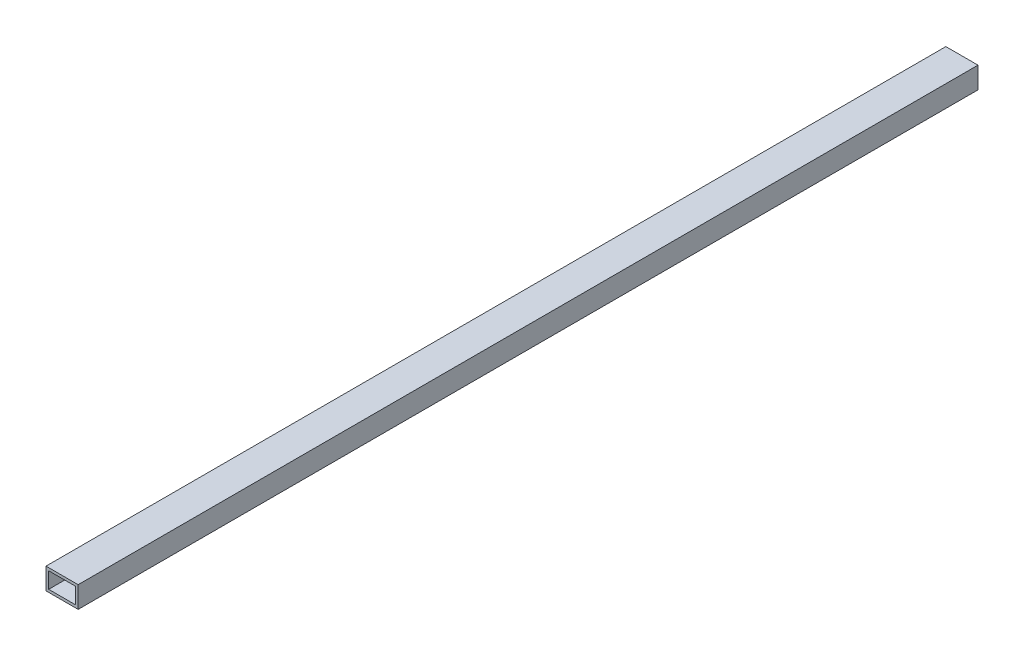
ISO-10303-21;
HEADER;
FILE_DESCRIPTION(('STEP AP214'),'2;1');
FILE_NAME('part.step','',(''),(''),'','','');
FILE_SCHEMA(('AUTOMOTIVE_DESIGN { 1 0 10303 214 1 1 1 1 }'));
ENDSEC;
DATA;
#1=APPLICATION_CONTEXT('core data for automotive mechanical design processes');
#2=APPLICATION_PROTOCOL_DEFINITION('international standard','automotive_design',2000,#1);
#3=PRODUCT_CONTEXT('',#1,'mechanical');
#4=PRODUCT('Part','Part','',(#3));
#5=PRODUCT_RELATED_PRODUCT_CATEGORY('part','',(#4));
#6=PRODUCT_DEFINITION_FORMATION('','',#4);
#7=PRODUCT_DEFINITION_CONTEXT('part definition',#1,'design');
#8=PRODUCT_DEFINITION('design','',#6,#7);
#9=PRODUCT_DEFINITION_SHAPE('','',#8);
#10=(LENGTH_UNIT() NAMED_UNIT(*) SI_UNIT(.MILLI.,.METRE.));
#11=(NAMED_UNIT(*) PLANE_ANGLE_UNIT() SI_UNIT($,.RADIAN.));
#12=(NAMED_UNIT(*) SI_UNIT($,.STERADIAN.) SOLID_ANGLE_UNIT());
#13=UNCERTAINTY_MEASURE_WITH_UNIT(LENGTH_MEASURE(1.E-05),#10,'distance_accuracy_value','');
#14=(GEOMETRIC_REPRESENTATION_CONTEXT(3) GLOBAL_UNCERTAINTY_ASSIGNED_CONTEXT((#13)) GLOBAL_UNIT_ASSIGNED_CONTEXT((#10,
#11,#12)) REPRESENTATION_CONTEXT('',''));
#15=CARTESIAN_POINT('',(0.,0.,0.));
#16=DIRECTION('',(0.,0.,1.));
#17=DIRECTION('',(1.,0.,0.));
#18=AXIS2_PLACEMENT_3D('',#15,#16,#17);
#19=CARTESIAN_POINT('',(19.05,12.7,1066.8));
#20=DIRECTION('',(-1.,0.,0.));
#21=DIRECTION('',(0.,-1.,0.));
#22=AXIS2_PLACEMENT_3D('',#19,#20,#21);
#23=PLANE('',#22);
#24=DIRECTION('',(0.,1.,0.));
#25=VECTOR('',#24,1.);
#26=CARTESIAN_POINT('',(19.05,12.7,0.));
#27=LINE('',#26,#25);
#28=CARTESIAN_POINT('',(19.05,-12.7,0.));
#29=VERTEX_POINT('',#28);
#30=CARTESIAN_POINT('',(19.05,12.7,0.));
#31=VERTEX_POINT('',#30);
#32=EDGE_CURVE('E145',#29,#31,#27,.T.);
#33=ORIENTED_EDGE('',*,*,#32,.T.);
#34=DIRECTION('',(0.,0.,-1.));
#35=VECTOR('',#34,1.);
#36=CARTESIAN_POINT('',(19.05,12.7,1066.8));
#37=LINE('',#36,#35);
#38=CARTESIAN_POINT('',(19.05,12.7,1066.8));
#39=VERTEX_POINT('',#38);
#40=EDGE_CURVE('E11',#39,#31,#37,.T.);
#41=ORIENTED_EDGE('',*,*,#40,.F.);
#42=DIRECTION('',(0.,1.,0.));
#43=VECTOR('',#42,1.);
#44=CARTESIAN_POINT('',(19.05,12.7,1066.8));
#45=LINE('',#44,#43);
#46=CARTESIAN_POINT('',(19.05,-12.7,1066.8));
#47=VERTEX_POINT('',#46);
#48=EDGE_CURVE('E134',#47,#39,#45,.T.);
#49=ORIENTED_EDGE('',*,*,#48,.F.);
#50=DIRECTION('',(0.,0.,-1.));
#51=VECTOR('',#50,1.);
#52=CARTESIAN_POINT('',(19.05,-12.7,1066.8));
#53=LINE('',#52,#51);
#54=EDGE_CURVE('E144',#47,#29,#53,.T.);
#55=ORIENTED_EDGE('',*,*,#54,.T.);
#56=EDGE_LOOP('',(#33,#41,#49,#55));
#57=FACE_BOUND('',#56,.T.);
#58=ADVANCED_FACE('F37',(#57),#23,.F.);
#59=CARTESIAN_POINT('',(-19.05,12.7,1066.8));
#60=DIRECTION('',(0.,-1.,0.));
#61=DIRECTION('',(0.,0.,-1.));
#62=AXIS2_PLACEMENT_3D('',#59,#60,#61);
#63=PLANE('',#62);
#64=DIRECTION('',(-1.,0.,0.));
#65=VECTOR('',#64,1.);
#66=CARTESIAN_POINT('',(-19.05,12.7,0.));
#67=LINE('',#66,#65);
#68=CARTESIAN_POINT('',(-19.05,12.7,0.));
#69=VERTEX_POINT('',#68);
#70=EDGE_CURVE('E148',#31,#69,#67,.T.);
#71=ORIENTED_EDGE('',*,*,#70,.T.);
#72=DIRECTION('',(0.,0.,-1.));
#73=VECTOR('',#72,1.);
#74=CARTESIAN_POINT('',(-19.05,12.7,1066.8));
#75=LINE('',#74,#73);
#76=CARTESIAN_POINT('',(-19.05,12.7,1066.8));
#77=VERTEX_POINT('',#76);
#78=EDGE_CURVE('E44',#77,#69,#75,.T.);
#79=ORIENTED_EDGE('',*,*,#78,.F.);
#80=DIRECTION('',(-1.,0.,0.));
#81=VECTOR('',#80,1.);
#82=CARTESIAN_POINT('',(-19.05,12.7,1066.8));
#83=LINE('',#82,#81);
#84=EDGE_CURVE('E137',#39,#77,#83,.T.);
#85=ORIENTED_EDGE('',*,*,#84,.F.);
#86=ORIENTED_EDGE('',*,*,#40,.T.);
#87=EDGE_LOOP('',(#71,#79,#85,#86));
#88=FACE_BOUND('',#87,.T.);
#89=ADVANCED_FACE('F176',(#88),#63,.F.);
#90=CARTESIAN_POINT('',(-19.05,12.7,1066.8));
#91=DIRECTION('',(1.,0.,0.));
#92=DIRECTION('',(0.,1.,0.));
#93=AXIS2_PLACEMENT_3D('',#90,#91,#92);
#94=PLANE('',#93);
#95=DIRECTION('',(0.,-1.,0.));
#96=VECTOR('',#95,1.);
#97=CARTESIAN_POINT('',(-19.05,12.7,0.));
#98=LINE('',#97,#96);
#99=CARTESIAN_POINT('',(-19.05,-12.7,0.));
#100=VERTEX_POINT('',#99);
#101=EDGE_CURVE('E150',#69,#100,#98,.T.);
#102=ORIENTED_EDGE('',*,*,#101,.T.);
#103=DIRECTION('',(0.,0.,-1.));
#104=VECTOR('',#103,1.);
#105=CARTESIAN_POINT('',(-19.05,-12.7,1066.8));
#106=LINE('',#105,#104);
#107=CARTESIAN_POINT('',(-19.05,-12.7,1066.8));
#108=VERTEX_POINT('',#107);
#109=EDGE_CURVE('E155',#108,#100,#106,.T.);
#110=ORIENTED_EDGE('',*,*,#109,.F.);
#111=DIRECTION('',(0.,-1.,0.));
#112=VECTOR('',#111,1.);
#113=CARTESIAN_POINT('',(-19.05,12.7,1066.8));
#114=LINE('',#113,#112);
#115=EDGE_CURVE('E140',#77,#108,#114,.T.);
#116=ORIENTED_EDGE('',*,*,#115,.F.);
#117=ORIENTED_EDGE('',*,*,#78,.T.);
#118=EDGE_LOOP('',(#102,#110,#116,#117));
#119=FACE_BOUND('',#118,.T.);
#120=ADVANCED_FACE('F162',(#119),#94,.F.);
#121=CARTESIAN_POINT('',(-19.05,-12.7,1066.8));
#122=DIRECTION('',(0.,1.,0.));
#123=DIRECTION('',(0.,0.,1.));
#124=AXIS2_PLACEMENT_3D('',#121,#122,#123);
#125=PLANE('',#124);
#126=DIRECTION('',(1.,0.,0.));
#127=VECTOR('',#126,1.);
#128=CARTESIAN_POINT('',(-19.05,-12.7,0.));
#129=LINE('',#128,#127);
#130=EDGE_CURVE('E138',#100,#29,#129,.T.);
#131=ORIENTED_EDGE('',*,*,#130,.T.);
#132=ORIENTED_EDGE('',*,*,#54,.F.);
#133=DIRECTION('',(1.,0.,0.));
#134=VECTOR('',#133,1.);
#135=CARTESIAN_POINT('',(-19.05,-12.7,1066.8));
#136=LINE('',#135,#134);
#137=EDGE_CURVE('E142',#108,#47,#136,.T.);
#138=ORIENTED_EDGE('',*,*,#137,.F.);
#139=ORIENTED_EDGE('',*,*,#109,.T.);
#140=EDGE_LOOP('',(#131,#132,#138,#139));
#141=FACE_BOUND('',#140,.T.);
#142=ADVANCED_FACE('F169',(#141),#125,.F.);
#143=CARTESIAN_POINT('',(0.,0.,1066.8));
#144=DIRECTION('',(0.,0.,1.));
#145=DIRECTION('',(1.,0.,0.));
#146=AXIS2_PLACEMENT_3D('',#143,#144,#145);
#147=PLANE('',#146);
#148=DIRECTION('',(0.,1.,0.));
#149=VECTOR('',#148,1.);
#150=CARTESIAN_POINT('',(15.875,12.7,1066.8));
#151=LINE('',#150,#149);
#152=CARTESIAN_POINT('',(15.875,-9.525,1066.8));
#153=VERTEX_POINT('',#152);
#154=CARTESIAN_POINT('',(15.875,9.525,1066.8));
#155=VERTEX_POINT('',#154);
#156=EDGE_CURVE('E122',#153,#155,#151,.T.);
#157=ORIENTED_EDGE('',*,*,#156,.F.);
#158=DIRECTION('',(1.,0.,0.));
#159=VECTOR('',#158,1.);
#160=CARTESIAN_POINT('',(-19.05,-9.525,1066.8));
#161=LINE('',#160,#159);
#162=CARTESIAN_POINT('',(-15.875,-9.525,1066.8));
#163=VERTEX_POINT('',#162);
#164=EDGE_CURVE('E106',#163,#153,#161,.T.);
#165=ORIENTED_EDGE('',*,*,#164,.F.);
#166=DIRECTION('',(0.,-1.,0.));
#167=VECTOR('',#166,1.);
#168=CARTESIAN_POINT('',(-15.875,12.7,1066.8));
#169=LINE('',#168,#167);
#170=CARTESIAN_POINT('',(-15.875,9.525,1066.8));
#171=VERTEX_POINT('',#170);
#172=EDGE_CURVE('E131',#171,#163,#169,.T.);
#173=ORIENTED_EDGE('',*,*,#172,.F.);
#174=DIRECTION('',(-1.,0.,0.));
#175=VECTOR('',#174,1.);
#176=CARTESIAN_POINT('',(-19.05,9.525,1066.8));
#177=LINE('',#176,#175);
#178=EDGE_CURVE('E124',#155,#171,#177,.T.);
#179=ORIENTED_EDGE('',*,*,#178,.F.);
#180=EDGE_LOOP('',(#157,#165,#173,#179));
#181=FACE_BOUND('',#180,.T.);
#182=ORIENTED_EDGE('',*,*,#48,.T.);
#183=ORIENTED_EDGE('',*,*,#84,.T.);
#184=ORIENTED_EDGE('',*,*,#115,.T.);
#185=ORIENTED_EDGE('',*,*,#137,.T.);
#186=EDGE_LOOP('',(#182,#183,#184,#185));
#187=FACE_BOUND('',#186,.T.);
#188=ADVANCED_FACE('F175',(#181,#187),#147,.T.);
#189=CARTESIAN_POINT('',(0.,0.,0.));
#190=DIRECTION('',(0.,0.,1.));
#191=DIRECTION('',(1.,0.,0.));
#192=AXIS2_PLACEMENT_3D('',#189,#190,#191);
#193=PLANE('',#192);
#194=DIRECTION('',(1.,0.,0.));
#195=VECTOR('',#194,1.);
#196=CARTESIAN_POINT('',(-19.05,-9.525,0.));
#197=LINE('',#196,#195);
#198=CARTESIAN_POINT('',(-15.875,-9.525,0.));
#199=VERTEX_POINT('',#198);
#200=CARTESIAN_POINT('',(15.875,-9.525,0.));
#201=VERTEX_POINT('',#200);
#202=EDGE_CURVE('E104',#199,#201,#197,.T.);
#203=ORIENTED_EDGE('',*,*,#202,.T.);
#204=DIRECTION('',(0.,1.,0.));
#205=VECTOR('',#204,1.);
#206=CARTESIAN_POINT('',(15.875,12.7,0.));
#207=LINE('',#206,#205);
#208=CARTESIAN_POINT('',(15.875,9.525,0.));
#209=VERTEX_POINT('',#208);
#210=EDGE_CURVE('E112',#201,#209,#207,.T.);
#211=ORIENTED_EDGE('',*,*,#210,.T.);
#212=DIRECTION('',(-1.,0.,0.));
#213=VECTOR('',#212,1.);
#214=CARTESIAN_POINT('',(-19.05,9.525,0.));
#215=LINE('',#214,#213);
#216=CARTESIAN_POINT('',(-15.875,9.525,0.));
#217=VERTEX_POINT('',#216);
#218=EDGE_CURVE('E118',#209,#217,#215,.T.);
#219=ORIENTED_EDGE('',*,*,#218,.T.);
#220=DIRECTION('',(0.,-1.,0.));
#221=VECTOR('',#220,1.);
#222=CARTESIAN_POINT('',(-15.875,12.7,0.));
#223=LINE('',#222,#221);
#224=EDGE_CURVE('E58',#217,#199,#223,.T.);
#225=ORIENTED_EDGE('',*,*,#224,.T.);
#226=EDGE_LOOP('',(#203,#211,#219,#225));
#227=FACE_BOUND('',#226,.T.);
#228=ORIENTED_EDGE('',*,*,#32,.F.);
#229=ORIENTED_EDGE('',*,*,#130,.F.);
#230=ORIENTED_EDGE('',*,*,#101,.F.);
#231=ORIENTED_EDGE('',*,*,#70,.F.);
#232=EDGE_LOOP('',(#228,#229,#230,#231));
#233=FACE_BOUND('',#232,.T.);
#234=ADVANCED_FACE('F120',(#227,#233),#193,.F.);
#235=CARTESIAN_POINT('',(15.875,12.7,1066.8));
#236=DIRECTION('',(-1.,0.,0.));
#237=DIRECTION('',(0.,-1.,0.));
#238=AXIS2_PLACEMENT_3D('',#235,#236,#237);
#239=PLANE('',#238);
#240=ORIENTED_EDGE('',*,*,#210,.F.);
#241=DIRECTION('',(0.,0.,-1.));
#242=VECTOR('',#241,1.);
#243=CARTESIAN_POINT('',(15.875,-9.525,1066.8));
#244=LINE('',#243,#242);
#245=EDGE_CURVE('E100',#153,#201,#244,.T.);
#246=ORIENTED_EDGE('',*,*,#245,.F.);
#247=ORIENTED_EDGE('',*,*,#156,.T.);
#248=DIRECTION('',(0.,0.,-1.));
#249=VECTOR('',#248,1.);
#250=CARTESIAN_POINT('',(15.875,9.525,1066.8));
#251=LINE('',#250,#249);
#252=EDGE_CURVE('E115',#155,#209,#251,.T.);
#253=ORIENTED_EDGE('',*,*,#252,.T.);
#254=EDGE_LOOP('',(#240,#246,#247,#253));
#255=FACE_BOUND('',#254,.T.);
#256=ADVANCED_FACE('F113',(#255),#239,.T.);
#257=CARTESIAN_POINT('',(-19.05,9.525,1066.8));
#258=DIRECTION('',(0.,-1.,0.));
#259=DIRECTION('',(0.,0.,-1.));
#260=AXIS2_PLACEMENT_3D('',#257,#258,#259);
#261=PLANE('',#260);
#262=ORIENTED_EDGE('',*,*,#218,.F.);
#263=ORIENTED_EDGE('',*,*,#252,.F.);
#264=ORIENTED_EDGE('',*,*,#178,.T.);
#265=DIRECTION('',(0.,0.,-1.));
#266=VECTOR('',#265,1.);
#267=CARTESIAN_POINT('',(-15.875,9.525,1066.8));
#268=LINE('',#267,#266);
#269=EDGE_CURVE('E280',#171,#217,#268,.T.);
#270=ORIENTED_EDGE('',*,*,#269,.T.);
#271=EDGE_LOOP('',(#262,#263,#264,#270));
#272=FACE_BOUND('',#271,.T.);
#273=ADVANCED_FACE('F196',(#272),#261,.T.);
#274=CARTESIAN_POINT('',(-15.875,12.7,1066.8));
#275=DIRECTION('',(1.,0.,0.));
#276=DIRECTION('',(0.,1.,0.));
#277=AXIS2_PLACEMENT_3D('',#274,#275,#276);
#278=PLANE('',#277);
#279=ORIENTED_EDGE('',*,*,#224,.F.);
#280=ORIENTED_EDGE('',*,*,#269,.F.);
#281=ORIENTED_EDGE('',*,*,#172,.T.);
#282=DIRECTION('',(0.,0.,-1.));
#283=VECTOR('',#282,1.);
#284=CARTESIAN_POINT('',(-15.875,-9.525,1066.8));
#285=LINE('',#284,#283);
#286=EDGE_CURVE('E51',#163,#199,#285,.T.);
#287=ORIENTED_EDGE('',*,*,#286,.T.);
#288=EDGE_LOOP('',(#279,#280,#281,#287));
#289=FACE_BOUND('',#288,.T.);
#290=ADVANCED_FACE('F193',(#289),#278,.T.);
#291=CARTESIAN_POINT('',(-19.05,-9.525,1066.8));
#292=DIRECTION('',(0.,1.,0.));
#293=DIRECTION('',(0.,0.,1.));
#294=AXIS2_PLACEMENT_3D('',#291,#292,#293);
#295=PLANE('',#294);
#296=ORIENTED_EDGE('',*,*,#202,.F.);
#297=ORIENTED_EDGE('',*,*,#286,.F.);
#298=ORIENTED_EDGE('',*,*,#164,.T.);
#299=ORIENTED_EDGE('',*,*,#245,.T.);
#300=EDGE_LOOP('',(#296,#297,#298,#299));
#301=FACE_BOUND('',#300,.T.);
#302=ADVANCED_FACE('F102',(#301),#295,.T.);
#303=CLOSED_SHELL('',(#58,#89,#120,#142,#188,#234,#256,#273,#290,#302));
#304=MANIFOLD_SOLID_BREP('B2',#303);
#305=ADVANCED_BREP_SHAPE_REPRESENTATION('',(#18,#304),#14);
#306=SHAPE_DEFINITION_REPRESENTATION(#9,#305);
ENDSEC;
END-ISO-10303-21;
